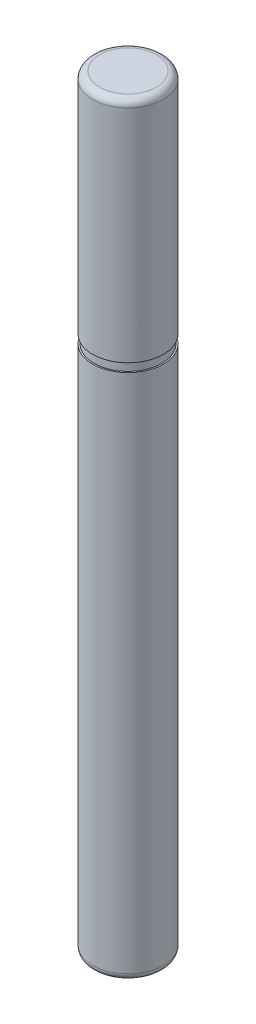
ISO-10303-21;
HEADER;
FILE_DESCRIPTION(('STEP AP214'),'2;1');
FILE_NAME('part.step','',(''),(''),'','','');
FILE_SCHEMA(('AUTOMOTIVE_DESIGN { 1 0 10303 214 1 1 1 1 }'));
ENDSEC;
DATA;
#1=APPLICATION_CONTEXT('core data for automotive mechanical design processes');
#2=APPLICATION_PROTOCOL_DEFINITION('international standard','automotive_design',2000,#1);
#3=PRODUCT_CONTEXT('',#1,'mechanical');
#4=PRODUCT('Part','Part','',(#3));
#5=PRODUCT_RELATED_PRODUCT_CATEGORY('part','',(#4));
#6=PRODUCT_DEFINITION_FORMATION('','',#4);
#7=PRODUCT_DEFINITION_CONTEXT('part definition',#1,'design');
#8=PRODUCT_DEFINITION('design','',#6,#7);
#9=PRODUCT_DEFINITION_SHAPE('','',#8);
#10=(LENGTH_UNIT() NAMED_UNIT(*) SI_UNIT(.MILLI.,.METRE.));
#11=(NAMED_UNIT(*) PLANE_ANGLE_UNIT() SI_UNIT($,.RADIAN.));
#12=(NAMED_UNIT(*) SI_UNIT($,.STERADIAN.) SOLID_ANGLE_UNIT());
#13=UNCERTAINTY_MEASURE_WITH_UNIT(LENGTH_MEASURE(1.E-05),#10,'distance_accuracy_value','');
#14=(GEOMETRIC_REPRESENTATION_CONTEXT(3) GLOBAL_UNCERTAINTY_ASSIGNED_CONTEXT((#13)) GLOBAL_UNIT_ASSIGNED_CONTEXT((#10,
#11,#12)) REPRESENTATION_CONTEXT('',''));
#15=CARTESIAN_POINT('',(0.,0.,0.));
#16=DIRECTION('',(0.,0.,1.));
#17=DIRECTION('',(1.,0.,0.));
#18=AXIS2_PLACEMENT_3D('',#15,#16,#17);
#19=CARTESIAN_POINT('',(0.,-27.,0.));
#20=DIRECTION('',(0.,1.,0.));
#21=DIRECTION('',(0.,0.,1.));
#22=AXIS2_PLACEMENT_3D('',#19,#20,#21);
#23=CYLINDRICAL_SURFACE('',#22,2.5);
#24=CARTESIAN_POINT('',(0.,10.3,0.));
#25=DIRECTION('',(0.,-1.,0.));
#26=DIRECTION('',(1.,0.,0.));
#27=AXIS2_PLACEMENT_3D('',#24,#25,#26);
#28=CIRCLE('',#27,2.5);
#29=CARTESIAN_POINT('',(2.5,10.3,0.));
#30=VERTEX_POINT('',#29);
#31=EDGE_CURVE('E42',#30,#30,#28,.T.);
#32=ORIENTED_EDGE('',*,*,#31,.T.);
#33=EDGE_LOOP('',(#32));
#34=FACE_BOUND('',#33,.T.);
#35=CARTESIAN_POINT('',(0.,-25.5,0.));
#36=DIRECTION('',(0.,1.,0.));
#37=DIRECTION('',(0.,0.,1.));
#38=AXIS2_PLACEMENT_3D('',#35,#36,#37);
#39=CIRCLE('',#38,2.5);
#40=CARTESIAN_POINT('',(1.5,-25.5,-2.));
#41=VERTEX_POINT('',#40);
#42=CARTESIAN_POINT('',(-1.5,-25.5,-2.));
#43=VERTEX_POINT('',#42);
#44=EDGE_CURVE('E81',#41,#43,#39,.T.);
#45=ORIENTED_EDGE('',*,*,#44,.F.);
#46=DIRECTION('',(0.,1.,0.));
#47=VECTOR('',#46,1.);
#48=CARTESIAN_POINT('',(1.5,-25.5,-2.));
#49=LINE('',#48,#47);
#50=CARTESIAN_POINT('',(1.5,-19.5,-2.));
#51=VERTEX_POINT('',#50);
#52=EDGE_CURVE('E93',#41,#51,#49,.T.);
#53=ORIENTED_EDGE('',*,*,#52,.T.);
#54=CARTESIAN_POINT('',(0.,-19.5,0.));
#55=DIRECTION('',(0.,1.,0.));
#56=DIRECTION('',(0.,0.,1.));
#57=AXIS2_PLACEMENT_3D('',#54,#55,#56);
#58=CIRCLE('',#57,2.5);
#59=CARTESIAN_POINT('',(-1.5,-19.5,-2.));
#60=VERTEX_POINT('',#59);
#61=EDGE_CURVE('E96',#51,#60,#58,.T.);
#62=ORIENTED_EDGE('',*,*,#61,.T.);
#63=DIRECTION('',(0.,1.,0.));
#64=VECTOR('',#63,1.);
#65=CARTESIAN_POINT('',(-1.5,-25.5,-2.));
#66=LINE('',#65,#64);
#67=EDGE_CURVE('E91',#43,#60,#66,.T.);
#68=ORIENTED_EDGE('',*,*,#67,.F.);
#69=EDGE_LOOP('',(#45,#53,#62,#68));
#70=FACE_BOUND('',#69,.T.);
#71=CARTESIAN_POINT('',(0.,-26.5,0.));
#72=DIRECTION('',(0.,-1.,0.));
#73=DIRECTION('',(0.,0.,-1.));
#74=AXIS2_PLACEMENT_3D('',#71,#72,#73);
#75=CIRCLE('',#74,2.5);
#76=CARTESIAN_POINT('',(0.,-26.5,-2.5));
#77=VERTEX_POINT('',#76);
#78=EDGE_CURVE('E47',#77,#77,#75,.F.);
#79=ORIENTED_EDGE('',*,*,#78,.T.);
#80=EDGE_LOOP('',(#79));
#81=FACE_BOUND('',#80,.T.);
#82=ADVANCED_FACE('F38',(#34,#70,#81),#23,.T.);
#83=CARTESIAN_POINT('',(0.,-27.,0.));
#84=DIRECTION('',(0.,-1.,0.));
#85=DIRECTION('',(0.,0.,-1.));
#86=AXIS2_PLACEMENT_3D('',#83,#84,#85);
#87=PLANE('',#86);
#88=CARTESIAN_POINT('',(0.,-27.,0.));
#89=DIRECTION('',(0.,-1.,0.));
#90=DIRECTION('',(0.,0.,-1.));
#91=AXIS2_PLACEMENT_3D('',#88,#89,#90);
#92=CIRCLE('',#91,2.);
#93=CARTESIAN_POINT('',(0.,-27.,-2.));
#94=VERTEX_POINT('',#93);
#95=EDGE_CURVE('E114',#94,#94,#92,.T.);
#96=ORIENTED_EDGE('',*,*,#95,.T.);
#97=EDGE_LOOP('',(#96));
#98=FACE_BOUND('',#97,.T.);
#99=ADVANCED_FACE('F155',(#98),#87,.T.);
#100=CARTESIAN_POINT('',(-1.5,-25.5,-2.));
#101=DIRECTION('',(0.,0.,1.));
#102=DIRECTION('',(1.,0.,0.));
#103=AXIS2_PLACEMENT_3D('',#100,#101,#102);
#104=PLANE('',#103);
#105=DIRECTION('',(1.,0.,0.));
#106=VECTOR('',#105,1.);
#107=CARTESIAN_POINT('',(-1.5,-19.5,-2.));
#108=LINE('',#107,#106);
#109=EDGE_CURVE('E54',#60,#51,#108,.T.);
#110=ORIENTED_EDGE('',*,*,#109,.T.);
#111=ORIENTED_EDGE('',*,*,#52,.F.);
#112=DIRECTION('',(1.,0.,0.));
#113=VECTOR('',#112,1.);
#114=CARTESIAN_POINT('',(-1.5,-25.5,-2.));
#115=LINE('',#114,#113);
#116=EDGE_CURVE('E84',#43,#41,#115,.T.);
#117=ORIENTED_EDGE('',*,*,#116,.F.);
#118=ORIENTED_EDGE('',*,*,#67,.T.);
#119=EDGE_LOOP('',(#110,#111,#117,#118));
#120=FACE_BOUND('',#119,.T.);
#121=ADVANCED_FACE('F90',(#120),#104,.F.);
#122=CARTESIAN_POINT('',(0.,-25.5,0.));
#123=DIRECTION('',(0.,1.,0.));
#124=DIRECTION('',(0.,0.,1.));
#125=AXIS2_PLACEMENT_3D('',#122,#123,#124);
#126=PLANE('',#125);
#127=ORIENTED_EDGE('',*,*,#44,.T.);
#128=ORIENTED_EDGE('',*,*,#116,.T.);
#129=EDGE_LOOP('',(#127,#128));
#130=FACE_BOUND('',#129,.T.);
#131=ADVANCED_FACE('F83',(#130),#126,.T.);
#132=CARTESIAN_POINT('',(0.,-19.5,0.));
#133=DIRECTION('',(0.,1.,0.));
#134=DIRECTION('',(0.,0.,1.));
#135=AXIS2_PLACEMENT_3D('',#132,#133,#134);
#136=PLANE('',#135);
#137=ORIENTED_EDGE('',*,*,#61,.F.);
#138=ORIENTED_EDGE('',*,*,#109,.F.);
#139=EDGE_LOOP('',(#137,#138));
#140=FACE_BOUND('',#139,.T.);
#141=ADVANCED_FACE('F194',(#140),#136,.F.);
#142=CARTESIAN_POINT('',(0.,-26.5,0.));
#143=DIRECTION('',(0.,-1.,0.));
#144=DIRECTION('',(0.,0.,-1.));
#145=AXIS2_PLACEMENT_3D('',#142,#143,#144);
#146=TOROIDAL_SURFACE('',#145,2.,0.5);
#147=ORIENTED_EDGE('',*,*,#78,.F.);
#148=EDGE_LOOP('',(#147));
#149=FACE_BOUND('',#148,.T.);
#150=ORIENTED_EDGE('',*,*,#95,.F.);
#151=EDGE_LOOP('',(#150));
#152=FACE_BOUND('',#151,.T.);
#153=ADVANCED_FACE('F152',(#149,#152),#146,.T.);
#154=CARTESIAN_POINT('',(2.4,10.3,0.));
#155=DIRECTION('',(0.,-1.,0.));
#156=DIRECTION('',(1.,0.,0.));
#157=AXIS2_PLACEMENT_3D('',#154,#155,#156);
#158=PLANE('',#157);
#159=CARTESIAN_POINT('',(0.,10.3,0.));
#160=DIRECTION('',(0.,-1.,0.));
#161=DIRECTION('',(1.,0.,0.));
#162=AXIS2_PLACEMENT_3D('',#159,#160,#161);
#163=CIRCLE('',#162,2.4);
#164=CARTESIAN_POINT('',(2.4,10.3,0.));
#165=VERTEX_POINT('',#164);
#166=EDGE_CURVE('E124',#165,#165,#163,.T.);
#167=ORIENTED_EDGE('',*,*,#166,.T.);
#168=EDGE_LOOP('',(#167));
#169=FACE_BOUND('',#168,.T.);
#170=ORIENTED_EDGE('',*,*,#31,.F.);
#171=EDGE_LOOP('',(#170));
#172=FACE_BOUND('',#171,.T.);
#173=ADVANCED_FACE('F143',(#169,#172),#158,.F.);
#174=CARTESIAN_POINT('',(2.4,10.9,0.));
#175=DIRECTION('',(0.,1.,0.));
#176=DIRECTION('',(-1.,0.,0.));
#177=AXIS2_PLACEMENT_3D('',#174,#175,#176);
#178=PLANE('',#177);
#179=CARTESIAN_POINT('',(0.,10.9,0.));
#180=DIRECTION('',(0.,-1.,0.));
#181=DIRECTION('',(1.,0.,0.));
#182=AXIS2_PLACEMENT_3D('',#179,#180,#181);
#183=CIRCLE('',#182,2.4);
#184=CARTESIAN_POINT('',(2.4,10.9,0.));
#185=VERTEX_POINT('',#184);
#186=EDGE_CURVE('E129',#185,#185,#183,.T.);
#187=ORIENTED_EDGE('',*,*,#186,.F.);
#188=EDGE_LOOP('',(#187));
#189=FACE_BOUND('',#188,.T.);
#190=CARTESIAN_POINT('',(0.,10.9,0.));
#191=DIRECTION('',(0.,1.,0.));
#192=DIRECTION('',(-1.,0.,0.));
#193=AXIS2_PLACEMENT_3D('',#190,#191,#192);
#194=CIRCLE('',#193,2.5);
#195=CARTESIAN_POINT('',(-2.5,10.9,0.));
#196=VERTEX_POINT('',#195);
#197=EDGE_CURVE('E122',#196,#196,#194,.T.);
#198=ORIENTED_EDGE('',*,*,#197,.F.);
#199=EDGE_LOOP('',(#198));
#200=FACE_BOUND('',#199,.T.);
#201=ADVANCED_FACE('F140',(#189,#200),#178,.F.);
#202=CARTESIAN_POINT('',(0.,0.,0.));
#203=DIRECTION('',(0.,-1.,0.));
#204=DIRECTION('',(1.,0.,0.));
#205=AXIS2_PLACEMENT_3D('',#202,#203,#204);
#206=CYLINDRICAL_SURFACE('',#205,2.4);
#207=ORIENTED_EDGE('',*,*,#166,.F.);
#208=EDGE_LOOP('',(#207));
#209=FACE_BOUND('',#208,.T.);
#210=ORIENTED_EDGE('',*,*,#186,.T.);
#211=EDGE_LOOP('',(#210));
#212=FACE_BOUND('',#211,.T.);
#213=ADVANCED_FACE('F138',(#209,#212),#206,.T.);
#214=CARTESIAN_POINT('',(0.,27.,0.));
#215=DIRECTION('',(0.,-1.,0.));
#216=DIRECTION('',(0.,0.,-1.));
#217=AXIS2_PLACEMENT_3D('',#214,#215,#216);
#218=PLANE('',#217);
#219=CARTESIAN_POINT('',(0.,27.,0.));
#220=DIRECTION('',(0.,-1.,0.));
#221=DIRECTION('',(0.,0.,-1.));
#222=AXIS2_PLACEMENT_3D('',#219,#220,#221);
#223=CIRCLE('',#222,2.);
#224=CARTESIAN_POINT('',(0.,27.,-2.));
#225=VERTEX_POINT('',#224);
#226=EDGE_CURVE('E11',#225,#225,#223,.F.);
#227=ORIENTED_EDGE('',*,*,#226,.T.);
#228=EDGE_LOOP('',(#227));
#229=FACE_BOUND('',#228,.T.);
#230=ADVANCED_FACE('F149',(#229),#218,.F.);
#231=CARTESIAN_POINT('',(0.,20.,0.));
#232=DIRECTION('',(0.,1.,0.));
#233=DIRECTION('',(0.,0.,1.));
#234=AXIS2_PLACEMENT_3D('',#231,#232,#233);
#235=PLANE('',#234);
#236=CARTESIAN_POINT('',(0.,20.,0.));
#237=DIRECTION('',(0.,1.,0.));
#238=DIRECTION('',(0.,0.,1.));
#239=AXIS2_PLACEMENT_3D('',#236,#237,#238);
#240=CIRCLE('',#239,2.5);
#241=CARTESIAN_POINT('',(1.5,20.,-2.));
#242=VERTEX_POINT('',#241);
#243=CARTESIAN_POINT('',(-1.5,20.,-2.));
#244=VERTEX_POINT('',#243);
#245=EDGE_CURVE('E98',#242,#244,#240,.T.);
#246=ORIENTED_EDGE('',*,*,#245,.F.);
#247=DIRECTION('',(1.,0.,0.));
#248=VECTOR('',#247,1.);
#249=CARTESIAN_POINT('',(-1.5,20.,-2.));
#250=LINE('',#249,#248);
#251=EDGE_CURVE('E61',#244,#242,#250,.T.);
#252=ORIENTED_EDGE('',*,*,#251,.F.);
#253=EDGE_LOOP('',(#246,#252));
#254=FACE_BOUND('',#253,.T.);
#255=ADVANCED_FACE('F180',(#254),#235,.F.);
#256=CARTESIAN_POINT('',(-1.5,17.5,-2.));
#257=DIRECTION('',(0.,0.,1.));
#258=DIRECTION('',(1.,0.,0.));
#259=AXIS2_PLACEMENT_3D('',#256,#257,#258);
#260=PLANE('',#259);
#261=ORIENTED_EDGE('',*,*,#251,.T.);
#262=DIRECTION('',(0.,1.,0.));
#263=VECTOR('',#262,1.);
#264=CARTESIAN_POINT('',(1.5,17.5,-2.));
#265=LINE('',#264,#263);
#266=CARTESIAN_POINT('',(1.5,17.5,-2.));
#267=VERTEX_POINT('',#266);
#268=EDGE_CURVE('E111',#267,#242,#265,.T.);
#269=ORIENTED_EDGE('',*,*,#268,.F.);
#270=DIRECTION('',(1.,0.,0.));
#271=VECTOR('',#270,1.);
#272=CARTESIAN_POINT('',(-1.5,17.5,-2.));
#273=LINE('',#272,#271);
#274=CARTESIAN_POINT('',(-1.5,17.5,-2.));
#275=VERTEX_POINT('',#274);
#276=EDGE_CURVE('E104',#275,#267,#273,.T.);
#277=ORIENTED_EDGE('',*,*,#276,.F.);
#278=DIRECTION('',(0.,1.,0.));
#279=VECTOR('',#278,1.);
#280=CARTESIAN_POINT('',(-1.5,17.5,-2.));
#281=LINE('',#280,#279);
#282=EDGE_CURVE('E107',#275,#244,#281,.T.);
#283=ORIENTED_EDGE('',*,*,#282,.T.);
#284=EDGE_LOOP('',(#261,#269,#277,#283));
#285=FACE_BOUND('',#284,.T.);
#286=ADVANCED_FACE('F179',(#285),#260,.F.);
#287=CARTESIAN_POINT('',(0.,17.5,0.));
#288=DIRECTION('',(0.,1.,0.));
#289=DIRECTION('',(0.,0.,1.));
#290=AXIS2_PLACEMENT_3D('',#287,#288,#289);
#291=PLANE('',#290);
#292=CARTESIAN_POINT('',(0.,17.5,0.));
#293=DIRECTION('',(0.,1.,0.));
#294=DIRECTION('',(0.,0.,1.));
#295=AXIS2_PLACEMENT_3D('',#292,#293,#294);
#296=CIRCLE('',#295,2.5);
#297=EDGE_CURVE('E102',#267,#275,#296,.T.);
#298=ORIENTED_EDGE('',*,*,#297,.T.);
#299=ORIENTED_EDGE('',*,*,#276,.T.);
#300=EDGE_LOOP('',(#298,#299));
#301=FACE_BOUND('',#300,.T.);
#302=ADVANCED_FACE('F169',(#301),#291,.T.);
#303=CARTESIAN_POINT('',(0.,26.5,0.));
#304=DIRECTION('',(0.,-1.,0.));
#305=DIRECTION('',(0.,0.,-1.));
#306=AXIS2_PLACEMENT_3D('',#303,#304,#305);
#307=TOROIDAL_SURFACE('',#306,2.,0.5);
#308=ORIENTED_EDGE('',*,*,#226,.F.);
#309=EDGE_LOOP('',(#308));
#310=FACE_BOUND('',#309,.T.);
#311=CARTESIAN_POINT('',(0.,26.5,0.));
#312=DIRECTION('',(0.,-1.,0.));
#313=DIRECTION('',(0.,0.,-1.));
#314=AXIS2_PLACEMENT_3D('',#311,#312,#313);
#315=CIRCLE('',#314,2.5);
#316=CARTESIAN_POINT('',(0.,26.5,-2.5));
#317=VERTEX_POINT('',#316);
#318=EDGE_CURVE('E118',#317,#317,#315,.T.);
#319=ORIENTED_EDGE('',*,*,#318,.F.);
#320=EDGE_LOOP('',(#319));
#321=FACE_BOUND('',#320,.T.);
#322=ADVANCED_FACE('F40',(#310,#321),#307,.T.);
#323=ORIENTED_EDGE('',*,*,#197,.T.);
#324=EDGE_LOOP('',(#323));
#325=FACE_BOUND('',#324,.T.);
#326=ORIENTED_EDGE('',*,*,#318,.T.);
#327=EDGE_LOOP('',(#326));
#328=FACE_BOUND('',#327,.T.);
#329=ORIENTED_EDGE('',*,*,#297,.F.);
#330=ORIENTED_EDGE('',*,*,#268,.T.);
#331=ORIENTED_EDGE('',*,*,#245,.T.);
#332=ORIENTED_EDGE('',*,*,#282,.F.);
#333=EDGE_LOOP('',(#329,#330,#331,#332));
#334=FACE_BOUND('',#333,.T.);
#335=ADVANCED_FACE('F158',(#325,#328,#334),#23,.T.);
#336=CLOSED_SHELL('',(#82,#99,#121,#131,#141,#153,#173,#201,#213,#230,#255,#286,#302,#322,#335));
#337=MANIFOLD_SOLID_BREP('B2',#336);
#338=ADVANCED_BREP_SHAPE_REPRESENTATION('',(#18,#337),#14);
#339=SHAPE_DEFINITION_REPRESENTATION(#9,#338);
ENDSEC;
END-ISO-10303-21;
